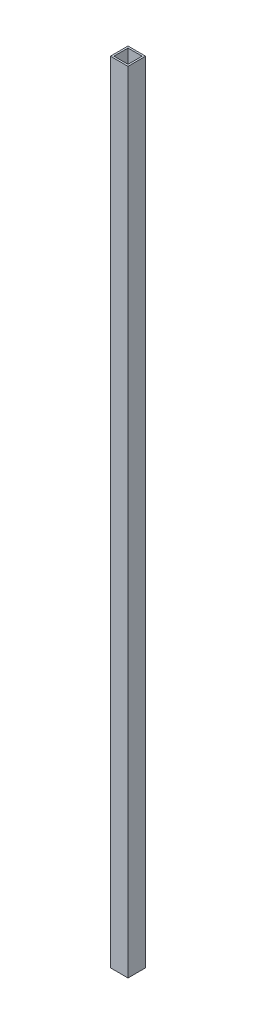
ISO-10303-21;
HEADER;
FILE_DESCRIPTION(('STEP AP214'),'2;1');
FILE_NAME('part.step','',(''),(''),'','','');
FILE_SCHEMA(('AUTOMOTIVE_DESIGN { 1 0 10303 214 1 1 1 1 }'));
ENDSEC;
DATA;
#1=APPLICATION_CONTEXT('core data for automotive mechanical design processes');
#2=APPLICATION_PROTOCOL_DEFINITION('international standard','automotive_design',2000,#1);
#3=PRODUCT_CONTEXT('',#1,'mechanical');
#4=PRODUCT('Part','Part','',(#3));
#5=PRODUCT_RELATED_PRODUCT_CATEGORY('part','',(#4));
#6=PRODUCT_DEFINITION_FORMATION('','',#4);
#7=PRODUCT_DEFINITION_CONTEXT('part definition',#1,'design');
#8=PRODUCT_DEFINITION('design','',#6,#7);
#9=PRODUCT_DEFINITION_SHAPE('','',#8);
#10=(LENGTH_UNIT() NAMED_UNIT(*) SI_UNIT(.MILLI.,.METRE.));
#11=(NAMED_UNIT(*) PLANE_ANGLE_UNIT() SI_UNIT($,.RADIAN.));
#12=(NAMED_UNIT(*) SI_UNIT($,.STERADIAN.) SOLID_ANGLE_UNIT());
#13=UNCERTAINTY_MEASURE_WITH_UNIT(LENGTH_MEASURE(1.E-05),#10,'distance_accuracy_value','');
#14=(GEOMETRIC_REPRESENTATION_CONTEXT(3) GLOBAL_UNCERTAINTY_ASSIGNED_CONTEXT((#13)) GLOBAL_UNIT_ASSIGNED_CONTEXT((#10,
#11,#12)) REPRESENTATION_CONTEXT('',''));
#15=CARTESIAN_POINT('',(0.,0.,0.));
#16=DIRECTION('',(0.,0.,1.));
#17=DIRECTION('',(1.,0.,0.));
#18=AXIS2_PLACEMENT_3D('',#15,#16,#17);
#19=CARTESIAN_POINT('',(0.,-4482.,-100.));
#20=DIRECTION('',(-1.,0.,0.));
#21=DIRECTION('',(0.,0.,1.));
#22=AXIS2_PLACEMENT_3D('',#19,#20,#21);
#23=PLANE('',#22);
#24=DIRECTION('',(0.,0.,1.));
#25=VECTOR('',#24,1.);
#26=CARTESIAN_POINT('',(0.,0.,-100.));
#27=LINE('',#26,#25);
#28=CARTESIAN_POINT('',(0.,0.,-100.));
#29=VERTEX_POINT('',#28);
#30=CARTESIAN_POINT('',(0.,0.,0.));
#31=VERTEX_POINT('',#30);
#32=EDGE_CURVE('E134',#29,#31,#27,.T.);
#33=ORIENTED_EDGE('',*,*,#32,.F.);
#34=DIRECTION('',(0.,1.,0.));
#35=VECTOR('',#34,1.);
#36=CARTESIAN_POINT('',(0.,-4482.,-100.));
#37=LINE('',#36,#35);
#38=CARTESIAN_POINT('',(0.,-4482.,-100.));
#39=VERTEX_POINT('',#38);
#40=EDGE_CURVE('E11',#39,#29,#37,.T.);
#41=ORIENTED_EDGE('',*,*,#40,.F.);
#42=DIRECTION('',(0.,0.,1.));
#43=VECTOR('',#42,1.);
#44=CARTESIAN_POINT('',(0.,-4482.,-100.));
#45=LINE('',#44,#43);
#46=CARTESIAN_POINT('',(0.,-4482.,0.));
#47=VERTEX_POINT('',#46);
#48=EDGE_CURVE('E138',#39,#47,#45,.T.);
#49=ORIENTED_EDGE('',*,*,#48,.T.);
#50=DIRECTION('',(0.,1.,0.));
#51=VECTOR('',#50,1.);
#52=CARTESIAN_POINT('',(0.,-4482.,0.));
#53=LINE('',#52,#51);
#54=EDGE_CURVE('E39',#47,#31,#53,.T.);
#55=ORIENTED_EDGE('',*,*,#54,.T.);
#56=EDGE_LOOP('',(#33,#41,#49,#55));
#57=FACE_BOUND('',#56,.T.);
#58=ADVANCED_FACE('F36',(#57),#23,.T.);
#59=CARTESIAN_POINT('',(100.,-4482.,-100.));
#60=DIRECTION('',(0.,0.,-1.));
#61=DIRECTION('',(-1.,0.,0.));
#62=AXIS2_PLACEMENT_3D('',#59,#60,#61);
#63=PLANE('',#62);
#64=DIRECTION('',(-1.,0.,0.));
#65=VECTOR('',#64,1.);
#66=CARTESIAN_POINT('',(100.,0.,-100.));
#67=LINE('',#66,#65);
#68=CARTESIAN_POINT('',(100.,0.,-100.));
#69=VERTEX_POINT('',#68);
#70=EDGE_CURVE('E142',#69,#29,#67,.T.);
#71=ORIENTED_EDGE('',*,*,#70,.F.);
#72=DIRECTION('',(0.,1.,0.));
#73=VECTOR('',#72,1.);
#74=CARTESIAN_POINT('',(100.,-4482.,-100.));
#75=LINE('',#74,#73);
#76=CARTESIAN_POINT('',(100.,-4482.,-100.));
#77=VERTEX_POINT('',#76);
#78=EDGE_CURVE('E44',#77,#69,#75,.T.);
#79=ORIENTED_EDGE('',*,*,#78,.F.);
#80=DIRECTION('',(-1.,0.,0.));
#81=VECTOR('',#80,1.);
#82=CARTESIAN_POINT('',(100.,-4482.,-100.));
#83=LINE('',#82,#81);
#84=EDGE_CURVE('E148',#77,#39,#83,.T.);
#85=ORIENTED_EDGE('',*,*,#84,.T.);
#86=ORIENTED_EDGE('',*,*,#40,.T.);
#87=EDGE_LOOP('',(#71,#79,#85,#86));
#88=FACE_BOUND('',#87,.T.);
#89=ADVANCED_FACE('F174',(#88),#63,.T.);
#90=CARTESIAN_POINT('',(100.,-4482.,0.));
#91=DIRECTION('',(1.,0.,0.));
#92=DIRECTION('',(0.,0.,-1.));
#93=AXIS2_PLACEMENT_3D('',#90,#91,#92);
#94=PLANE('',#93);
#95=DIRECTION('',(0.,0.,-1.));
#96=VECTOR('',#95,1.);
#97=CARTESIAN_POINT('',(100.,0.,0.));
#98=LINE('',#97,#96);
#99=CARTESIAN_POINT('',(100.,0.,0.));
#100=VERTEX_POINT('',#99);
#101=EDGE_CURVE('E156',#100,#69,#98,.T.);
#102=ORIENTED_EDGE('',*,*,#101,.F.);
#103=DIRECTION('',(0.,1.,0.));
#104=VECTOR('',#103,1.);
#105=CARTESIAN_POINT('',(100.,-4482.,0.));
#106=LINE('',#105,#104);
#107=CARTESIAN_POINT('',(100.,-4482.,0.));
#108=VERTEX_POINT('',#107);
#109=EDGE_CURVE('E161',#108,#100,#106,.T.);
#110=ORIENTED_EDGE('',*,*,#109,.F.);
#111=DIRECTION('',(0.,0.,-1.));
#112=VECTOR('',#111,1.);
#113=CARTESIAN_POINT('',(100.,-4482.,0.));
#114=LINE('',#113,#112);
#115=EDGE_CURVE('E145',#108,#77,#114,.T.);
#116=ORIENTED_EDGE('',*,*,#115,.T.);
#117=ORIENTED_EDGE('',*,*,#78,.T.);
#118=EDGE_LOOP('',(#102,#110,#116,#117));
#119=FACE_BOUND('',#118,.T.);
#120=ADVANCED_FACE('F178',(#119),#94,.T.);
#121=CARTESIAN_POINT('',(0.,-4482.,0.));
#122=DIRECTION('',(0.,0.,1.));
#123=DIRECTION('',(1.,0.,0.));
#124=AXIS2_PLACEMENT_3D('',#121,#122,#123);
#125=PLANE('',#124);
#126=DIRECTION('',(1.,0.,0.));
#127=VECTOR('',#126,1.);
#128=CARTESIAN_POINT('',(0.,0.,0.));
#129=LINE('',#128,#127);
#130=EDGE_CURVE('E153',#31,#100,#129,.T.);
#131=ORIENTED_EDGE('',*,*,#130,.F.);
#132=ORIENTED_EDGE('',*,*,#54,.F.);
#133=DIRECTION('',(1.,0.,0.));
#134=VECTOR('',#133,1.);
#135=CARTESIAN_POINT('',(0.,-4482.,0.));
#136=LINE('',#135,#134);
#137=EDGE_CURVE('E141',#47,#108,#136,.T.);
#138=ORIENTED_EDGE('',*,*,#137,.T.);
#139=ORIENTED_EDGE('',*,*,#109,.T.);
#140=EDGE_LOOP('',(#131,#132,#138,#139));
#141=FACE_BOUND('',#140,.T.);
#142=ADVANCED_FACE('F169',(#141),#125,.T.);
#143=CARTESIAN_POINT('',(0.,-4482.,0.));
#144=DIRECTION('',(0.,1.,0.));
#145=DIRECTION('',(0.,0.,1.));
#146=AXIS2_PLACEMENT_3D('',#143,#144,#145);
#147=PLANE('',#146);
#148=DIRECTION('',(-1.,0.,0.));
#149=VECTOR('',#148,1.);
#150=CARTESIAN_POINT('',(10.,-4482.,-90.));
#151=LINE('',#150,#149);
#152=CARTESIAN_POINT('',(90.,-4482.,-90.));
#153=VERTEX_POINT('',#152);
#154=CARTESIAN_POINT('',(10.,-4482.,-90.));
#155=VERTEX_POINT('',#154);
#156=EDGE_CURVE('E109',#153,#155,#151,.T.);
#157=ORIENTED_EDGE('',*,*,#156,.T.);
#158=DIRECTION('',(0.,0.,1.));
#159=VECTOR('',#158,1.);
#160=CARTESIAN_POINT('',(10.,-4482.,-10.));
#161=LINE('',#160,#159);
#162=CARTESIAN_POINT('',(10.,-4482.,-10.));
#163=VERTEX_POINT('',#162);
#164=EDGE_CURVE('E103',#155,#163,#161,.T.);
#165=ORIENTED_EDGE('',*,*,#164,.T.);
#166=DIRECTION('',(1.,0.,0.));
#167=VECTOR('',#166,1.);
#168=CARTESIAN_POINT('',(10.,-4482.,-10.));
#169=LINE('',#168,#167);
#170=CARTESIAN_POINT('',(90.,-4482.,-10.));
#171=VERTEX_POINT('',#170);
#172=EDGE_CURVE('E112',#163,#171,#169,.T.);
#173=ORIENTED_EDGE('',*,*,#172,.T.);
#174=DIRECTION('',(0.,0.,-1.));
#175=VECTOR('',#174,1.);
#176=CARTESIAN_POINT('',(90.,-4482.,-10.));
#177=LINE('',#176,#175);
#178=EDGE_CURVE('E52',#171,#153,#177,.T.);
#179=ORIENTED_EDGE('',*,*,#178,.T.);
#180=EDGE_LOOP('',(#157,#165,#173,#179));
#181=FACE_BOUND('',#180,.T.);
#182=ORIENTED_EDGE('',*,*,#48,.F.);
#183=ORIENTED_EDGE('',*,*,#84,.F.);
#184=ORIENTED_EDGE('',*,*,#115,.F.);
#185=ORIENTED_EDGE('',*,*,#137,.F.);
#186=EDGE_LOOP('',(#182,#183,#184,#185));
#187=FACE_BOUND('',#186,.T.);
#188=ADVANCED_FACE('F116',(#181,#187),#147,.F.);
#189=CARTESIAN_POINT('',(0.,0.,0.));
#190=DIRECTION('',(0.,1.,0.));
#191=DIRECTION('',(0.,0.,1.));
#192=AXIS2_PLACEMENT_3D('',#189,#190,#191);
#193=PLANE('',#192);
#194=DIRECTION('',(0.,0.,1.));
#195=VECTOR('',#194,1.);
#196=CARTESIAN_POINT('',(10.,0.,-10.));
#197=LINE('',#196,#195);
#198=CARTESIAN_POINT('',(10.,0.,-90.));
#199=VERTEX_POINT('',#198);
#200=CARTESIAN_POINT('',(10.,0.,-10.));
#201=VERTEX_POINT('',#200);
#202=EDGE_CURVE('E60',#199,#201,#197,.T.);
#203=ORIENTED_EDGE('',*,*,#202,.F.);
#204=DIRECTION('',(-1.,0.,0.));
#205=VECTOR('',#204,1.);
#206=CARTESIAN_POINT('',(10.,0.,-90.));
#207=LINE('',#206,#205);
#208=CARTESIAN_POINT('',(90.,0.,-90.));
#209=VERTEX_POINT('',#208);
#210=EDGE_CURVE('E119',#209,#199,#207,.T.);
#211=ORIENTED_EDGE('',*,*,#210,.F.);
#212=DIRECTION('',(0.,0.,-1.));
#213=VECTOR('',#212,1.);
#214=CARTESIAN_POINT('',(90.,0.,-10.));
#215=LINE('',#214,#213);
#216=CARTESIAN_POINT('',(90.,0.,-10.));
#217=VERTEX_POINT('',#216);
#218=EDGE_CURVE('E122',#217,#209,#215,.T.);
#219=ORIENTED_EDGE('',*,*,#218,.F.);
#220=DIRECTION('',(1.,0.,0.));
#221=VECTOR('',#220,1.);
#222=CARTESIAN_POINT('',(10.,0.,-10.));
#223=LINE('',#222,#221);
#224=EDGE_CURVE('E128',#201,#217,#223,.T.);
#225=ORIENTED_EDGE('',*,*,#224,.F.);
#226=EDGE_LOOP('',(#203,#211,#219,#225));
#227=FACE_BOUND('',#226,.T.);
#228=ORIENTED_EDGE('',*,*,#32,.T.);
#229=ORIENTED_EDGE('',*,*,#130,.T.);
#230=ORIENTED_EDGE('',*,*,#101,.T.);
#231=ORIENTED_EDGE('',*,*,#70,.T.);
#232=EDGE_LOOP('',(#228,#229,#230,#231));
#233=FACE_BOUND('',#232,.T.);
#234=ADVANCED_FACE('F171',(#227,#233),#193,.T.);
#235=CARTESIAN_POINT('',(10.,-4482.,-10.));
#236=DIRECTION('',(-1.,0.,0.));
#237=DIRECTION('',(0.,0.,1.));
#238=AXIS2_PLACEMENT_3D('',#235,#236,#237);
#239=PLANE('',#238);
#240=ORIENTED_EDGE('',*,*,#202,.T.);
#241=DIRECTION('',(0.,1.,0.));
#242=VECTOR('',#241,1.);
#243=CARTESIAN_POINT('',(10.,-4482.,-10.));
#244=LINE('',#243,#242);
#245=EDGE_CURVE('E99',#163,#201,#244,.T.);
#246=ORIENTED_EDGE('',*,*,#245,.F.);
#247=ORIENTED_EDGE('',*,*,#164,.F.);
#248=DIRECTION('',(0.,1.,0.));
#249=VECTOR('',#248,1.);
#250=CARTESIAN_POINT('',(10.,-4482.,-90.));
#251=LINE('',#250,#249);
#252=EDGE_CURVE('E132',#155,#199,#251,.T.);
#253=ORIENTED_EDGE('',*,*,#252,.T.);
#254=EDGE_LOOP('',(#240,#246,#247,#253));
#255=FACE_BOUND('',#254,.T.);
#256=ADVANCED_FACE('F101',(#255),#239,.F.);
#257=CARTESIAN_POINT('',(10.,-4482.,-90.));
#258=DIRECTION('',(0.,0.,-1.));
#259=DIRECTION('',(-1.,0.,0.));
#260=AXIS2_PLACEMENT_3D('',#257,#258,#259);
#261=PLANE('',#260);
#262=ORIENTED_EDGE('',*,*,#210,.T.);
#263=ORIENTED_EDGE('',*,*,#252,.F.);
#264=ORIENTED_EDGE('',*,*,#156,.F.);
#265=DIRECTION('',(0.,1.,0.));
#266=VECTOR('',#265,1.);
#267=CARTESIAN_POINT('',(90.,-4482.,-90.));
#268=LINE('',#267,#266);
#269=EDGE_CURVE('E135',#153,#209,#268,.T.);
#270=ORIENTED_EDGE('',*,*,#269,.T.);
#271=EDGE_LOOP('',(#262,#263,#264,#270));
#272=FACE_BOUND('',#271,.T.);
#273=ADVANCED_FACE('F229',(#272),#261,.F.);
#274=CARTESIAN_POINT('',(90.,-4482.,-10.));
#275=DIRECTION('',(1.,0.,0.));
#276=DIRECTION('',(0.,0.,-1.));
#277=AXIS2_PLACEMENT_3D('',#274,#275,#276);
#278=PLANE('',#277);
#279=ORIENTED_EDGE('',*,*,#218,.T.);
#280=ORIENTED_EDGE('',*,*,#269,.F.);
#281=ORIENTED_EDGE('',*,*,#178,.F.);
#282=DIRECTION('',(0.,1.,0.));
#283=VECTOR('',#282,1.);
#284=CARTESIAN_POINT('',(90.,-4482.,-10.));
#285=LINE('',#284,#283);
#286=EDGE_CURVE('E108',#171,#217,#285,.T.);
#287=ORIENTED_EDGE('',*,*,#286,.T.);
#288=EDGE_LOOP('',(#279,#280,#281,#287));
#289=FACE_BOUND('',#288,.T.);
#290=ADVANCED_FACE('F238',(#289),#278,.F.);
#291=CARTESIAN_POINT('',(10.,-4482.,-10.));
#292=DIRECTION('',(0.,0.,1.));
#293=DIRECTION('',(1.,0.,0.));
#294=AXIS2_PLACEMENT_3D('',#291,#292,#293);
#295=PLANE('',#294);
#296=ORIENTED_EDGE('',*,*,#224,.T.);
#297=ORIENTED_EDGE('',*,*,#286,.F.);
#298=ORIENTED_EDGE('',*,*,#172,.F.);
#299=ORIENTED_EDGE('',*,*,#245,.T.);
#300=EDGE_LOOP('',(#296,#297,#298,#299));
#301=FACE_BOUND('',#300,.T.);
#302=ADVANCED_FACE('F113',(#301),#295,.F.);
#303=CLOSED_SHELL('',(#58,#89,#120,#142,#188,#234,#256,#273,#290,#302));
#304=MANIFOLD_SOLID_BREP('B2',#303);
#305=ADVANCED_BREP_SHAPE_REPRESENTATION('',(#18,#304),#14);
#306=SHAPE_DEFINITION_REPRESENTATION(#9,#305);
ENDSEC;
END-ISO-10303-21;
